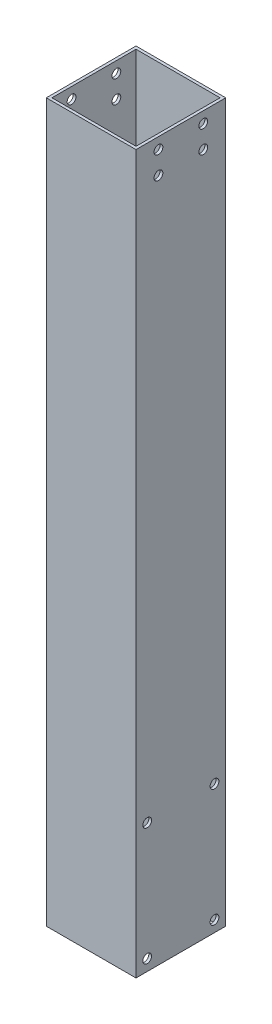
ISO-10303-21;
HEADER;
FILE_DESCRIPTION(('STEP AP214'),'2;1');
FILE_NAME('part.step','',(''),(''),'','','');
FILE_SCHEMA(('AUTOMOTIVE_DESIGN { 1 0 10303 214 1 1 1 1 }'));
ENDSEC;
DATA;
#1=APPLICATION_CONTEXT('core data for automotive mechanical design processes');
#2=APPLICATION_PROTOCOL_DEFINITION('international standard','automotive_design',2000,#1);
#3=PRODUCT_CONTEXT('',#1,'mechanical');
#4=PRODUCT('Part','Part','',(#3));
#5=PRODUCT_RELATED_PRODUCT_CATEGORY('part','',(#4));
#6=PRODUCT_DEFINITION_FORMATION('','',#4);
#7=PRODUCT_DEFINITION_CONTEXT('part definition',#1,'design');
#8=PRODUCT_DEFINITION('design','',#6,#7);
#9=PRODUCT_DEFINITION_SHAPE('','',#8);
#10=(LENGTH_UNIT() NAMED_UNIT(*) SI_UNIT(.MILLI.,.METRE.));
#11=(NAMED_UNIT(*) PLANE_ANGLE_UNIT() SI_UNIT($,.RADIAN.));
#12=(NAMED_UNIT(*) SI_UNIT($,.STERADIAN.) SOLID_ANGLE_UNIT());
#13=UNCERTAINTY_MEASURE_WITH_UNIT(LENGTH_MEASURE(1.E-05),#10,'distance_accuracy_value','');
#14=(GEOMETRIC_REPRESENTATION_CONTEXT(3) GLOBAL_UNCERTAINTY_ASSIGNED_CONTEXT((#13)) GLOBAL_UNIT_ASSIGNED_CONTEXT((#10,
#11,#12)) REPRESENTATION_CONTEXT('',''));
#15=CARTESIAN_POINT('',(0.,0.,0.));
#16=DIRECTION('',(0.,0.,1.));
#17=DIRECTION('',(1.,0.,0.));
#18=AXIS2_PLACEMENT_3D('',#15,#16,#17);
#19=CARTESIAN_POINT('',(0.,406.4,50.8));
#20=DIRECTION('',(0.,1.,0.));
#21=DIRECTION('',(0.,0.,-1.));
#22=AXIS2_PLACEMENT_3D('',#19,#20,#21);
#23=PLANE('',#22);
#24=DIRECTION('',(-1.,0.,0.));
#25=VECTOR('',#24,1.);
#26=CARTESIAN_POINT('',(0.,406.4,0.));
#27=LINE('',#26,#25);
#28=CARTESIAN_POINT('',(50.8,406.4,0.));
#29=VERTEX_POINT('',#28);
#30=CARTESIAN_POINT('',(0.,406.4,0.));
#31=VERTEX_POINT('',#30);
#32=EDGE_CURVE('E148',#29,#31,#27,.T.);
#33=ORIENTED_EDGE('',*,*,#32,.T.);
#34=DIRECTION('',(0.,0.,-1.));
#35=VECTOR('',#34,1.);
#36=CARTESIAN_POINT('',(0.,406.4,50.8));
#37=LINE('',#36,#35);
#38=CARTESIAN_POINT('',(0.,406.4,50.8));
#39=VERTEX_POINT('',#38);
#40=EDGE_CURVE('E11',#39,#31,#37,.T.);
#41=ORIENTED_EDGE('',*,*,#40,.F.);
#42=DIRECTION('',(-1.,0.,0.));
#43=VECTOR('',#42,1.);
#44=CARTESIAN_POINT('',(0.,406.4,50.8));
#45=LINE('',#44,#43);
#46=CARTESIAN_POINT('',(50.8,406.4,50.8));
#47=VERTEX_POINT('',#46);
#48=EDGE_CURVE('E153',#47,#39,#45,.T.);
#49=ORIENTED_EDGE('',*,*,#48,.F.);
#50=DIRECTION('',(0.,0.,-1.));
#51=VECTOR('',#50,1.);
#52=CARTESIAN_POINT('',(50.8,406.4,50.8));
#53=LINE('',#52,#51);
#54=EDGE_CURVE('E48',#47,#29,#53,.T.);
#55=ORIENTED_EDGE('',*,*,#54,.T.);
#56=EDGE_LOOP('',(#33,#41,#49,#55));
#57=FACE_BOUND('',#56,.T.);
#58=DIRECTION('',(0.,0.,-1.));
#59=VECTOR('',#58,1.);
#60=CARTESIAN_POINT('',(49.2125,406.4,50.8));
#61=LINE('',#60,#59);
#62=CARTESIAN_POINT('',(49.2125,406.4,49.2125));
#63=VERTEX_POINT('',#62);
#64=CARTESIAN_POINT('',(49.2125,406.4,1.5875));
#65=VERTEX_POINT('',#64);
#66=EDGE_CURVE('E128',#63,#65,#61,.T.);
#67=ORIENTED_EDGE('',*,*,#66,.F.);
#68=DIRECTION('',(-1.,0.,0.));
#69=VECTOR('',#68,1.);
#70=CARTESIAN_POINT('',(0.,406.4,49.2125));
#71=LINE('',#70,#69);
#72=CARTESIAN_POINT('',(1.5875,406.4,49.2125));
#73=VERTEX_POINT('',#72);
#74=EDGE_CURVE('E126',#63,#73,#71,.T.);
#75=ORIENTED_EDGE('',*,*,#74,.T.);
#76=DIRECTION('',(0.,0.,-1.));
#77=VECTOR('',#76,1.);
#78=CARTESIAN_POINT('',(1.5875,406.4,50.8));
#79=LINE('',#78,#77);
#80=CARTESIAN_POINT('',(1.5875,406.4,1.5875));
#81=VERTEX_POINT('',#80);
#82=EDGE_CURVE('E108',#73,#81,#79,.T.);
#83=ORIENTED_EDGE('',*,*,#82,.T.);
#84=DIRECTION('',(-1.,0.,0.));
#85=VECTOR('',#84,1.);
#86=CARTESIAN_POINT('',(0.,406.4,1.5875));
#87=LINE('',#86,#85);
#88=EDGE_CURVE('E119',#65,#81,#87,.T.);
#89=ORIENTED_EDGE('',*,*,#88,.F.);
#90=EDGE_LOOP('',(#67,#75,#83,#89));
#91=FACE_BOUND('',#90,.T.);
#92=ADVANCED_FACE('F39',(#57,#91),#23,.T.);
#93=CARTESIAN_POINT('',(0.,0.,50.8));
#94=DIRECTION('',(0.,-1.,0.));
#95=DIRECTION('',(0.,0.,1.));
#96=AXIS2_PLACEMENT_3D('',#93,#94,#95);
#97=PLANE('',#96);
#98=DIRECTION('',(1.,0.,0.));
#99=VECTOR('',#98,1.);
#100=CARTESIAN_POINT('',(0.,0.,0.));
#101=LINE('',#100,#99);
#102=CARTESIAN_POINT('',(0.,0.,0.));
#103=VERTEX_POINT('',#102);
#104=CARTESIAN_POINT('',(50.8,0.,0.));
#105=VERTEX_POINT('',#104);
#106=EDGE_CURVE('E130',#103,#105,#101,.T.);
#107=ORIENTED_EDGE('',*,*,#106,.T.);
#108=DIRECTION('',(0.,0.,-1.));
#109=VECTOR('',#108,1.);
#110=CARTESIAN_POINT('',(50.8,0.,50.8));
#111=LINE('',#110,#109);
#112=CARTESIAN_POINT('',(50.8,0.,50.8));
#113=VERTEX_POINT('',#112);
#114=EDGE_CURVE('E165',#113,#105,#111,.T.);
#115=ORIENTED_EDGE('',*,*,#114,.F.);
#116=DIRECTION('',(1.,0.,0.));
#117=VECTOR('',#116,1.);
#118=CARTESIAN_POINT('',(0.,0.,50.8));
#119=LINE('',#118,#117);
#120=CARTESIAN_POINT('',(0.,0.,50.8));
#121=VERTEX_POINT('',#120);
#122=EDGE_CURVE('E147',#121,#113,#119,.T.);
#123=ORIENTED_EDGE('',*,*,#122,.F.);
#124=DIRECTION('',(0.,0.,-1.));
#125=VECTOR('',#124,1.);
#126=CARTESIAN_POINT('',(0.,0.,50.8));
#127=LINE('',#126,#125);
#128=EDGE_CURVE('E155',#121,#103,#127,.T.);
#129=ORIENTED_EDGE('',*,*,#128,.T.);
#130=EDGE_LOOP('',(#107,#115,#123,#129));
#131=FACE_BOUND('',#130,.T.);
#132=DIRECTION('',(0.,0.,-1.));
#133=VECTOR('',#132,1.);
#134=CARTESIAN_POINT('',(1.5875,0.,50.8));
#135=LINE('',#134,#133);
#136=CARTESIAN_POINT('',(1.5875,0.,49.2125));
#137=VERTEX_POINT('',#136);
#138=CARTESIAN_POINT('',(1.5875,0.,1.5875));
#139=VERTEX_POINT('',#138);
#140=EDGE_CURVE('E111',#137,#139,#135,.T.);
#141=ORIENTED_EDGE('',*,*,#140,.F.);
#142=DIRECTION('',(1.,0.,0.));
#143=VECTOR('',#142,1.);
#144=CARTESIAN_POINT('',(0.,0.,49.2125));
#145=LINE('',#144,#143);
#146=CARTESIAN_POINT('',(49.2125,0.,49.2125));
#147=VERTEX_POINT('',#146);
#148=EDGE_CURVE('E139',#137,#147,#145,.T.);
#149=ORIENTED_EDGE('',*,*,#148,.T.);
#150=DIRECTION('',(0.,0.,-1.));
#151=VECTOR('',#150,1.);
#152=CARTESIAN_POINT('',(49.2125,0.,50.8));
#153=LINE('',#152,#151);
#154=CARTESIAN_POINT('',(49.2125,0.,1.5875));
#155=VERTEX_POINT('',#154);
#156=EDGE_CURVE('E132',#147,#155,#153,.T.);
#157=ORIENTED_EDGE('',*,*,#156,.T.);
#158=DIRECTION('',(1.,0.,0.));
#159=VECTOR('',#158,1.);
#160=CARTESIAN_POINT('',(0.,0.,1.5875));
#161=LINE('',#160,#159);
#162=EDGE_CURVE('E115',#139,#155,#161,.T.);
#163=ORIENTED_EDGE('',*,*,#162,.F.);
#164=EDGE_LOOP('',(#141,#149,#157,#163));
#165=FACE_BOUND('',#164,.T.);
#166=ADVANCED_FACE('F256',(#131,#165),#97,.T.);
#167=CARTESIAN_POINT('',(0.,0.,50.8));
#168=DIRECTION('',(-1.,0.,0.));
#169=DIRECTION('',(0.,0.,-1.));
#170=AXIS2_PLACEMENT_3D('',#167,#168,#169);
#171=PLANE('',#170);
#172=CARTESIAN_POINT('',(0.,73.025,44.45));
#173=DIRECTION('',(1.,0.,0.));
#174=DIRECTION('',(0.,0.,-1.));
#175=AXIS2_PLACEMENT_3D('',#172,#173,#174);
#176=CIRCLE('',#175,2.4892);
#177=CARTESIAN_POINT('',(0.,73.025,41.9608));
#178=VERTEX_POINT('',#177);
#179=EDGE_CURVE('E596',#178,#178,#176,.T.);
#180=ORIENTED_EDGE('',*,*,#179,.T.);
#181=EDGE_LOOP('',(#180));
#182=FACE_BOUND('',#181,.T.);
#183=CARTESIAN_POINT('',(0.,73.025,6.35));
#184=DIRECTION('',(1.,0.,0.));
#185=DIRECTION('',(0.,0.,-1.));
#186=AXIS2_PLACEMENT_3D('',#183,#184,#185);
#187=CIRCLE('',#186,2.4892);
#188=CARTESIAN_POINT('',(0.,73.025,3.8608));
#189=VERTEX_POINT('',#188);
#190=EDGE_CURVE('E610',#189,#189,#187,.T.);
#191=ORIENTED_EDGE('',*,*,#190,.T.);
#192=EDGE_LOOP('',(#191));
#193=FACE_BOUND('',#192,.T.);
#194=CARTESIAN_POINT('',(0.,6.35000000000004,6.35000000000005));
#195=DIRECTION('',(1.,0.,0.));
#196=DIRECTION('',(0.,0.,-1.));
#197=AXIS2_PLACEMENT_3D('',#194,#195,#196);
#198=CIRCLE('',#197,2.4892);
#199=CARTESIAN_POINT('',(0.,6.35000000000004,3.86080000000005));
#200=VERTEX_POINT('',#199);
#201=EDGE_CURVE('E604',#200,#200,#198,.T.);
#202=ORIENTED_EDGE('',*,*,#201,.T.);
#203=EDGE_LOOP('',(#202));
#204=FACE_BOUND('',#203,.T.);
#205=CARTESIAN_POINT('',(0.,6.35000000000003,44.4500000000001));
#206=DIRECTION('',(1.,0.,0.));
#207=DIRECTION('',(0.,0.,-1.));
#208=AXIS2_PLACEMENT_3D('',#205,#206,#207);
#209=CIRCLE('',#208,2.4892);
#210=CARTESIAN_POINT('',(0.,6.35000000000003,41.9608000000001));
#211=VERTEX_POINT('',#210);
#212=EDGE_CURVE('E602',#211,#211,#209,.T.);
#213=ORIENTED_EDGE('',*,*,#212,.T.);
#214=EDGE_LOOP('',(#213));
#215=FACE_BOUND('',#214,.T.);
#216=CARTESIAN_POINT('',(0.,400.05,12.7));
#217=DIRECTION('',(1.,0.,0.));
#218=DIRECTION('',(0.,0.,-1.));
#219=AXIS2_PLACEMENT_3D('',#216,#217,#218);
#220=CIRCLE('',#219,2.48920000000001);
#221=CARTESIAN_POINT('',(0.,400.05,10.2108));
#222=VERTEX_POINT('',#221);
#223=EDGE_CURVE('E218',#222,#222,#220,.T.);
#224=ORIENTED_EDGE('',*,*,#223,.T.);
#225=EDGE_LOOP('',(#224));
#226=FACE_BOUND('',#225,.T.);
#227=CARTESIAN_POINT('',(0.,387.35,38.1));
#228=DIRECTION('',(1.,0.,0.));
#229=DIRECTION('',(0.,0.,-1.));
#230=AXIS2_PLACEMENT_3D('',#227,#228,#229);
#231=CIRCLE('',#230,2.4892);
#232=CARTESIAN_POINT('',(0.,387.35,35.6108));
#233=VERTEX_POINT('',#232);
#234=EDGE_CURVE('E225',#233,#233,#231,.T.);
#235=ORIENTED_EDGE('',*,*,#234,.T.);
#236=EDGE_LOOP('',(#235));
#237=FACE_BOUND('',#236,.T.);
#238=CARTESIAN_POINT('',(0.,387.35,12.7));
#239=DIRECTION('',(1.,0.,0.));
#240=DIRECTION('',(0.,0.,-1.));
#241=AXIS2_PLACEMENT_3D('',#238,#239,#240);
#242=CIRCLE('',#241,2.48920000000001);
#243=CARTESIAN_POINT('',(0.,387.35,10.2108));
#244=VERTEX_POINT('',#243);
#245=EDGE_CURVE('E212',#244,#244,#242,.T.);
#246=ORIENTED_EDGE('',*,*,#245,.T.);
#247=EDGE_LOOP('',(#246));
#248=FACE_BOUND('',#247,.T.);
#249=CARTESIAN_POINT('',(0.,400.05,38.1));
#250=DIRECTION('',(1.,0.,0.));
#251=DIRECTION('',(0.,0.,-1.));
#252=AXIS2_PLACEMENT_3D('',#249,#250,#251);
#253=CIRCLE('',#252,2.4892);
#254=CARTESIAN_POINT('',(0.,400.05,35.6108));
#255=VERTEX_POINT('',#254);
#256=EDGE_CURVE('E221',#255,#255,#253,.T.);
#257=ORIENTED_EDGE('',*,*,#256,.T.);
#258=EDGE_LOOP('',(#257));
#259=FACE_BOUND('',#258,.T.);
#260=DIRECTION('',(0.,-1.,0.));
#261=VECTOR('',#260,1.);
#262=CARTESIAN_POINT('',(0.,0.,0.));
#263=LINE('',#262,#261);
#264=EDGE_CURVE('E127',#31,#103,#263,.T.);
#265=ORIENTED_EDGE('',*,*,#264,.T.);
#266=ORIENTED_EDGE('',*,*,#128,.F.);
#267=DIRECTION('',(0.,-1.,0.));
#268=VECTOR('',#267,1.);
#269=CARTESIAN_POINT('',(0.,0.,50.8));
#270=LINE('',#269,#268);
#271=EDGE_CURVE('E145',#39,#121,#270,.T.);
#272=ORIENTED_EDGE('',*,*,#271,.F.);
#273=ORIENTED_EDGE('',*,*,#40,.T.);
#274=EDGE_LOOP('',(#265,#266,#272,#273));
#275=FACE_BOUND('',#274,.T.);
#276=ADVANCED_FACE('F41',(#182,#193,#204,#215,#226,#237,#248,#259,#275),#171,.T.);
#277=CARTESIAN_POINT('',(50.8,0.,50.8));
#278=DIRECTION('',(1.,0.,0.));
#279=DIRECTION('',(0.,0.,1.));
#280=AXIS2_PLACEMENT_3D('',#277,#278,#279);
#281=PLANE('',#280);
#282=CARTESIAN_POINT('',(50.8,73.025,44.45));
#283=DIRECTION('',(1.,0.,0.));
#284=DIRECTION('',(0.,0.,-1.));
#285=AXIS2_PLACEMENT_3D('',#282,#283,#284);
#286=CIRCLE('',#285,2.4892);
#287=CARTESIAN_POINT('',(50.8,73.025,41.9608));
#288=VERTEX_POINT('',#287);
#289=EDGE_CURVE('E280',#288,#288,#286,.T.);
#290=ORIENTED_EDGE('',*,*,#289,.F.);
#291=EDGE_LOOP('',(#290));
#292=FACE_BOUND('',#291,.T.);
#293=CARTESIAN_POINT('',(50.8,73.025,6.35));
#294=DIRECTION('',(1.,0.,0.));
#295=DIRECTION('',(0.,0.,-1.));
#296=AXIS2_PLACEMENT_3D('',#293,#294,#295);
#297=CIRCLE('',#296,2.4892);
#298=CARTESIAN_POINT('',(50.8,73.025,3.8608));
#299=VERTEX_POINT('',#298);
#300=EDGE_CURVE('E284',#299,#299,#297,.T.);
#301=ORIENTED_EDGE('',*,*,#300,.F.);
#302=EDGE_LOOP('',(#301));
#303=FACE_BOUND('',#302,.T.);
#304=CARTESIAN_POINT('',(50.8,6.35000000000004,6.35000000000005));
#305=DIRECTION('',(1.,0.,0.));
#306=DIRECTION('',(0.,0.,-1.));
#307=AXIS2_PLACEMENT_3D('',#304,#305,#306);
#308=CIRCLE('',#307,2.4892);
#309=CARTESIAN_POINT('',(50.8,6.35000000000004,3.86080000000005));
#310=VERTEX_POINT('',#309);
#311=EDGE_CURVE('E288',#310,#310,#308,.T.);
#312=ORIENTED_EDGE('',*,*,#311,.F.);
#313=EDGE_LOOP('',(#312));
#314=FACE_BOUND('',#313,.T.);
#315=CARTESIAN_POINT('',(50.8,6.35000000000003,44.4500000000001));
#316=DIRECTION('',(1.,0.,0.));
#317=DIRECTION('',(0.,0.,-1.));
#318=AXIS2_PLACEMENT_3D('',#315,#316,#317);
#319=CIRCLE('',#318,2.4892);
#320=CARTESIAN_POINT('',(50.8,6.35000000000003,41.9608000000001));
#321=VERTEX_POINT('',#320);
#322=EDGE_CURVE('E190',#321,#321,#319,.T.);
#323=ORIENTED_EDGE('',*,*,#322,.F.);
#324=EDGE_LOOP('',(#323));
#325=FACE_BOUND('',#324,.T.);
#326=CARTESIAN_POINT('',(50.8,400.05,12.7));
#327=DIRECTION('',(1.,0.,0.));
#328=DIRECTION('',(0.,0.,-1.));
#329=AXIS2_PLACEMENT_3D('',#326,#327,#328);
#330=CIRCLE('',#329,2.48920000000001);
#331=CARTESIAN_POINT('',(50.8,400.05,10.2108));
#332=VERTEX_POINT('',#331);
#333=EDGE_CURVE('E222',#332,#332,#330,.T.);
#334=ORIENTED_EDGE('',*,*,#333,.F.);
#335=EDGE_LOOP('',(#334));
#336=FACE_BOUND('',#335,.T.);
#337=CARTESIAN_POINT('',(50.8,387.35,38.1));
#338=DIRECTION('',(1.,0.,0.));
#339=DIRECTION('',(0.,0.,-1.));
#340=AXIS2_PLACEMENT_3D('',#337,#338,#339);
#341=CIRCLE('',#340,2.4892);
#342=CARTESIAN_POINT('',(50.8,387.35,35.6108));
#343=VERTEX_POINT('',#342);
#344=EDGE_CURVE('E215',#343,#343,#341,.T.);
#345=ORIENTED_EDGE('',*,*,#344,.F.);
#346=EDGE_LOOP('',(#345));
#347=FACE_BOUND('',#346,.T.);
#348=CARTESIAN_POINT('',(50.8,387.35,12.7));
#349=DIRECTION('',(1.,0.,0.));
#350=DIRECTION('',(0.,0.,-1.));
#351=AXIS2_PLACEMENT_3D('',#348,#349,#350);
#352=CIRCLE('',#351,2.48920000000001);
#353=CARTESIAN_POINT('',(50.8,387.35,10.2108));
#354=VERTEX_POINT('',#353);
#355=EDGE_CURVE('E211',#354,#354,#352,.T.);
#356=ORIENTED_EDGE('',*,*,#355,.F.);
#357=EDGE_LOOP('',(#356));
#358=FACE_BOUND('',#357,.T.);
#359=CARTESIAN_POINT('',(50.8,400.05,38.1));
#360=DIRECTION('',(1.,0.,0.));
#361=DIRECTION('',(0.,0.,-1.));
#362=AXIS2_PLACEMENT_3D('',#359,#360,#361);
#363=CIRCLE('',#362,2.4892);
#364=CARTESIAN_POINT('',(50.8,400.05,35.6108));
#365=VERTEX_POINT('',#364);
#366=EDGE_CURVE('E174',#365,#365,#363,.T.);
#367=ORIENTED_EDGE('',*,*,#366,.F.);
#368=EDGE_LOOP('',(#367));
#369=FACE_BOUND('',#368,.T.);
#370=DIRECTION('',(0.,1.,0.));
#371=VECTOR('',#370,1.);
#372=CARTESIAN_POINT('',(50.8,0.,0.));
#373=LINE('',#372,#371);
#374=EDGE_CURVE('E159',#105,#29,#373,.T.);
#375=ORIENTED_EDGE('',*,*,#374,.T.);
#376=ORIENTED_EDGE('',*,*,#54,.F.);
#377=DIRECTION('',(0.,1.,0.));
#378=VECTOR('',#377,1.);
#379=CARTESIAN_POINT('',(50.8,0.,50.8));
#380=LINE('',#379,#378);
#381=EDGE_CURVE('E151',#113,#47,#380,.T.);
#382=ORIENTED_EDGE('',*,*,#381,.F.);
#383=ORIENTED_EDGE('',*,*,#114,.T.);
#384=EDGE_LOOP('',(#375,#376,#382,#383));
#385=FACE_BOUND('',#384,.T.);
#386=ADVANCED_FACE('F267',(#292,#303,#314,#325,#336,#347,#358,#369,#385),#281,.T.);
#387=CARTESIAN_POINT('',(0.,0.,50.8));
#388=DIRECTION('',(0.,0.,1.));
#389=DIRECTION('',(-1.,0.,0.));
#390=AXIS2_PLACEMENT_3D('',#387,#388,#389);
#391=PLANE('',#390);
#392=ORIENTED_EDGE('',*,*,#271,.T.);
#393=ORIENTED_EDGE('',*,*,#122,.T.);
#394=ORIENTED_EDGE('',*,*,#381,.T.);
#395=ORIENTED_EDGE('',*,*,#48,.T.);
#396=EDGE_LOOP('',(#392,#393,#394,#395));
#397=FACE_BOUND('',#396,.T.);
#398=ADVANCED_FACE('F269',(#397),#391,.T.);
#399=CARTESIAN_POINT('',(0.,0.,0.));
#400=DIRECTION('',(0.,0.,1.));
#401=DIRECTION('',(-1.,0.,0.));
#402=AXIS2_PLACEMENT_3D('',#399,#400,#401);
#403=PLANE('',#402);
#404=ORIENTED_EDGE('',*,*,#264,.F.);
#405=ORIENTED_EDGE('',*,*,#32,.F.);
#406=ORIENTED_EDGE('',*,*,#374,.F.);
#407=ORIENTED_EDGE('',*,*,#106,.F.);
#408=EDGE_LOOP('',(#404,#405,#406,#407));
#409=FACE_BOUND('',#408,.T.);
#410=ADVANCED_FACE('F265',(#409),#403,.F.);
#411=CARTESIAN_POINT('',(1.5875,0.,50.8));
#412=DIRECTION('',(-1.,0.,0.));
#413=DIRECTION('',(0.,0.,-1.));
#414=AXIS2_PLACEMENT_3D('',#411,#412,#413);
#415=PLANE('',#414);
#416=CARTESIAN_POINT('',(1.5875,73.025,44.45));
#417=DIRECTION('',(1.,0.,0.));
#418=DIRECTION('',(0.,0.,-1.));
#419=AXIS2_PLACEMENT_3D('',#416,#417,#418);
#420=CIRCLE('',#419,2.4892);
#421=CARTESIAN_POINT('',(1.5875,73.025,41.9608));
#422=VERTEX_POINT('',#421);
#423=EDGE_CURVE('E208',#422,#422,#420,.T.);
#424=ORIENTED_EDGE('',*,*,#423,.F.);
#425=EDGE_LOOP('',(#424));
#426=FACE_BOUND('',#425,.T.);
#427=CARTESIAN_POINT('',(1.5875,73.025,6.35));
#428=DIRECTION('',(1.,0.,0.));
#429=DIRECTION('',(0.,0.,-1.));
#430=AXIS2_PLACEMENT_3D('',#427,#428,#429);
#431=CIRCLE('',#430,2.4892);
#432=CARTESIAN_POINT('',(1.5875,73.025,3.8608));
#433=VERTEX_POINT('',#432);
#434=EDGE_CURVE('E196',#433,#433,#431,.T.);
#435=ORIENTED_EDGE('',*,*,#434,.F.);
#436=EDGE_LOOP('',(#435));
#437=FACE_BOUND('',#436,.T.);
#438=CARTESIAN_POINT('',(1.5875,6.35000000000004,6.35000000000005));
#439=DIRECTION('',(1.,0.,0.));
#440=DIRECTION('',(0.,0.,-1.));
#441=AXIS2_PLACEMENT_3D('',#438,#439,#440);
#442=CIRCLE('',#441,2.4892);
#443=CARTESIAN_POINT('',(1.5875,6.35000000000004,3.86080000000005));
#444=VERTEX_POINT('',#443);
#445=EDGE_CURVE('E193',#444,#444,#442,.T.);
#446=ORIENTED_EDGE('',*,*,#445,.F.);
#447=EDGE_LOOP('',(#446));
#448=FACE_BOUND('',#447,.T.);
#449=CARTESIAN_POINT('',(1.5875,6.35000000000003,44.4500000000001));
#450=DIRECTION('',(1.,0.,0.));
#451=DIRECTION('',(0.,0.,-1.));
#452=AXIS2_PLACEMENT_3D('',#449,#450,#451);
#453=CIRCLE('',#452,2.4892);
#454=CARTESIAN_POINT('',(1.5875,6.35000000000003,41.9608000000001));
#455=VERTEX_POINT('',#454);
#456=EDGE_CURVE('E189',#455,#455,#453,.T.);
#457=ORIENTED_EDGE('',*,*,#456,.F.);
#458=EDGE_LOOP('',(#457));
#459=FACE_BOUND('',#458,.T.);
#460=CARTESIAN_POINT('',(1.5875,400.05,12.7));
#461=DIRECTION('',(1.,0.,0.));
#462=DIRECTION('',(0.,0.,-1.));
#463=AXIS2_PLACEMENT_3D('',#460,#461,#462);
#464=CIRCLE('',#463,2.48920000000001);
#465=CARTESIAN_POINT('',(1.5875,400.05,10.2108));
#466=VERTEX_POINT('',#465);
#467=EDGE_CURVE('E116',#466,#466,#464,.T.);
#468=ORIENTED_EDGE('',*,*,#467,.F.);
#469=EDGE_LOOP('',(#468));
#470=FACE_BOUND('',#469,.T.);
#471=CARTESIAN_POINT('',(1.5875,387.35,38.1));
#472=DIRECTION('',(1.,0.,0.));
#473=DIRECTION('',(0.,0.,-1.));
#474=AXIS2_PLACEMENT_3D('',#471,#472,#473);
#475=CIRCLE('',#474,2.4892);
#476=CARTESIAN_POINT('',(1.5875,387.35,35.6108));
#477=VERTEX_POINT('',#476);
#478=EDGE_CURVE('E182',#477,#477,#475,.T.);
#479=ORIENTED_EDGE('',*,*,#478,.F.);
#480=EDGE_LOOP('',(#479));
#481=FACE_BOUND('',#480,.T.);
#482=CARTESIAN_POINT('',(1.5875,387.35,12.7));
#483=DIRECTION('',(1.,0.,0.));
#484=DIRECTION('',(0.,0.,-1.));
#485=AXIS2_PLACEMENT_3D('',#482,#483,#484);
#486=CIRCLE('',#485,2.48920000000001);
#487=CARTESIAN_POINT('',(1.5875,387.35,10.2108));
#488=VERTEX_POINT('',#487);
#489=EDGE_CURVE('E178',#488,#488,#486,.T.);
#490=ORIENTED_EDGE('',*,*,#489,.F.);
#491=EDGE_LOOP('',(#490));
#492=FACE_BOUND('',#491,.T.);
#493=CARTESIAN_POINT('',(1.5875,400.05,38.1));
#494=DIRECTION('',(1.,0.,0.));
#495=DIRECTION('',(0.,0.,-1.));
#496=AXIS2_PLACEMENT_3D('',#493,#494,#495);
#497=CIRCLE('',#496,2.4892);
#498=CARTESIAN_POINT('',(1.5875,400.05,35.6108));
#499=VERTEX_POINT('',#498);
#500=EDGE_CURVE('E173',#499,#499,#497,.T.);
#501=ORIENTED_EDGE('',*,*,#500,.F.);
#502=EDGE_LOOP('',(#501));
#503=FACE_BOUND('',#502,.T.);
#504=DIRECTION('',(0.,-1.,0.));
#505=VECTOR('',#504,1.);
#506=CARTESIAN_POINT('',(1.5875,0.,1.5875));
#507=LINE('',#506,#505);
#508=EDGE_CURVE('E104',#81,#139,#507,.T.);
#509=ORIENTED_EDGE('',*,*,#508,.F.);
#510=ORIENTED_EDGE('',*,*,#82,.F.);
#511=DIRECTION('',(0.,-1.,0.));
#512=VECTOR('',#511,1.);
#513=CARTESIAN_POINT('',(1.5875,0.,49.2125));
#514=LINE('',#513,#512);
#515=EDGE_CURVE('E56',#73,#137,#514,.T.);
#516=ORIENTED_EDGE('',*,*,#515,.T.);
#517=ORIENTED_EDGE('',*,*,#140,.T.);
#518=EDGE_LOOP('',(#509,#510,#516,#517));
#519=FACE_BOUND('',#518,.T.);
#520=ADVANCED_FACE('F106',(#426,#437,#448,#459,#470,#481,#492,#503,#519),#415,.F.);
#521=CARTESIAN_POINT('',(49.2125,0.,50.8));
#522=DIRECTION('',(1.,0.,0.));
#523=DIRECTION('',(0.,0.,1.));
#524=AXIS2_PLACEMENT_3D('',#521,#522,#523);
#525=PLANE('',#524);
#526=CARTESIAN_POINT('',(49.2125,73.025,44.45));
#527=DIRECTION('',(-1.,0.,0.));
#528=DIRECTION('',(0.,0.,1.));
#529=AXIS2_PLACEMENT_3D('',#526,#527,#528);
#530=CIRCLE('',#529,2.4892);
#531=CARTESIAN_POINT('',(49.2125,73.025,46.9392));
#532=VERTEX_POINT('',#531);
#533=EDGE_CURVE('E43',#532,#532,#530,.T.);
#534=ORIENTED_EDGE('',*,*,#533,.F.);
#535=EDGE_LOOP('',(#534));
#536=FACE_BOUND('',#535,.T.);
#537=CARTESIAN_POINT('',(49.2125,73.025,6.35));
#538=DIRECTION('',(-1.,0.,0.));
#539=DIRECTION('',(0.,0.,1.));
#540=AXIS2_PLACEMENT_3D('',#537,#538,#539);
#541=CIRCLE('',#540,2.4892);
#542=CARTESIAN_POINT('',(49.2125,73.025,8.8392));
#543=VERTEX_POINT('',#542);
#544=EDGE_CURVE('E194',#543,#543,#541,.T.);
#545=ORIENTED_EDGE('',*,*,#544,.F.);
#546=EDGE_LOOP('',(#545));
#547=FACE_BOUND('',#546,.T.);
#548=CARTESIAN_POINT('',(49.2125,6.35000000000004,6.35000000000005));
#549=DIRECTION('',(-1.,0.,0.));
#550=DIRECTION('',(0.,0.,1.));
#551=AXIS2_PLACEMENT_3D('',#548,#549,#550);
#552=CIRCLE('',#551,2.4892);
#553=CARTESIAN_POINT('',(49.2125,6.35000000000004,8.83920000000005));
#554=VERTEX_POINT('',#553);
#555=EDGE_CURVE('E191',#554,#554,#552,.T.);
#556=ORIENTED_EDGE('',*,*,#555,.F.);
#557=EDGE_LOOP('',(#556));
#558=FACE_BOUND('',#557,.T.);
#559=CARTESIAN_POINT('',(49.2125,6.35000000000003,44.4500000000001));
#560=DIRECTION('',(-1.,0.,0.));
#561=DIRECTION('',(0.,0.,1.));
#562=AXIS2_PLACEMENT_3D('',#559,#560,#561);
#563=CIRCLE('',#562,2.4892);
#564=CARTESIAN_POINT('',(49.2125,6.35000000000003,46.9392));
#565=VERTEX_POINT('',#564);
#566=EDGE_CURVE('E186',#565,#565,#563,.T.);
#567=ORIENTED_EDGE('',*,*,#566,.F.);
#568=EDGE_LOOP('',(#567));
#569=FACE_BOUND('',#568,.T.);
#570=CARTESIAN_POINT('',(49.2125,400.05,12.7));
#571=DIRECTION('',(-1.,0.,0.));
#572=DIRECTION('',(0.,0.,1.));
#573=AXIS2_PLACEMENT_3D('',#570,#571,#572);
#574=CIRCLE('',#573,2.48920000000001);
#575=CARTESIAN_POINT('',(49.2125,400.05,15.1892));
#576=VERTEX_POINT('',#575);
#577=EDGE_CURVE('E183',#576,#576,#574,.T.);
#578=ORIENTED_EDGE('',*,*,#577,.F.);
#579=EDGE_LOOP('',(#578));
#580=FACE_BOUND('',#579,.T.);
#581=CARTESIAN_POINT('',(49.2125,387.35,38.1));
#582=DIRECTION('',(-1.,0.,0.));
#583=DIRECTION('',(0.,0.,1.));
#584=AXIS2_PLACEMENT_3D('',#581,#582,#583);
#585=CIRCLE('',#584,2.4892);
#586=CARTESIAN_POINT('',(49.2125,387.35,40.5892));
#587=VERTEX_POINT('',#586);
#588=EDGE_CURVE('E179',#587,#587,#585,.T.);
#589=ORIENTED_EDGE('',*,*,#588,.F.);
#590=EDGE_LOOP('',(#589));
#591=FACE_BOUND('',#590,.T.);
#592=CARTESIAN_POINT('',(49.2125,387.35,12.7));
#593=DIRECTION('',(-1.,0.,0.));
#594=DIRECTION('',(0.,0.,1.));
#595=AXIS2_PLACEMENT_3D('',#592,#593,#594);
#596=CIRCLE('',#595,2.48920000000001);
#597=CARTESIAN_POINT('',(49.2125,387.35,15.1892));
#598=VERTEX_POINT('',#597);
#599=EDGE_CURVE('E175',#598,#598,#596,.T.);
#600=ORIENTED_EDGE('',*,*,#599,.F.);
#601=EDGE_LOOP('',(#600));
#602=FACE_BOUND('',#601,.T.);
#603=CARTESIAN_POINT('',(49.2125,400.05,38.1));
#604=DIRECTION('',(-1.,0.,0.));
#605=DIRECTION('',(0.,0.,1.));
#606=AXIS2_PLACEMENT_3D('',#603,#604,#605);
#607=CIRCLE('',#606,2.4892);
#608=CARTESIAN_POINT('',(49.2125,400.05,40.5892));
#609=VERTEX_POINT('',#608);
#610=EDGE_CURVE('E170',#609,#609,#607,.T.);
#611=ORIENTED_EDGE('',*,*,#610,.F.);
#612=EDGE_LOOP('',(#611));
#613=FACE_BOUND('',#612,.T.);
#614=DIRECTION('',(0.,1.,0.));
#615=VECTOR('',#614,1.);
#616=CARTESIAN_POINT('',(49.2125,0.,1.5875));
#617=LINE('',#616,#615);
#618=EDGE_CURVE('E121',#155,#65,#617,.T.);
#619=ORIENTED_EDGE('',*,*,#618,.F.);
#620=ORIENTED_EDGE('',*,*,#156,.F.);
#621=DIRECTION('',(0.,1.,0.));
#622=VECTOR('',#621,1.);
#623=CARTESIAN_POINT('',(49.2125,0.,49.2125));
#624=LINE('',#623,#622);
#625=EDGE_CURVE('E61',#147,#63,#624,.T.);
#626=ORIENTED_EDGE('',*,*,#625,.T.);
#627=ORIENTED_EDGE('',*,*,#66,.T.);
#628=EDGE_LOOP('',(#619,#620,#626,#627));
#629=FACE_BOUND('',#628,.T.);
#630=ADVANCED_FACE('F243',(#536,#547,#558,#569,#580,#591,#602,#613,#629),#525,.F.);
#631=CARTESIAN_POINT('',(0.,0.,49.2125));
#632=DIRECTION('',(0.,0.,1.));
#633=DIRECTION('',(-1.,0.,0.));
#634=AXIS2_PLACEMENT_3D('',#631,#632,#633);
#635=PLANE('',#634);
#636=ORIENTED_EDGE('',*,*,#515,.F.);
#637=ORIENTED_EDGE('',*,*,#74,.F.);
#638=ORIENTED_EDGE('',*,*,#625,.F.);
#639=ORIENTED_EDGE('',*,*,#148,.F.);
#640=EDGE_LOOP('',(#636,#637,#638,#639));
#641=FACE_BOUND('',#640,.T.);
#642=ADVANCED_FACE('F244',(#641),#635,.F.);
#643=CARTESIAN_POINT('',(0.,0.,1.5875));
#644=DIRECTION('',(0.,0.,1.));
#645=DIRECTION('',(-1.,0.,0.));
#646=AXIS2_PLACEMENT_3D('',#643,#644,#645);
#647=PLANE('',#646);
#648=ORIENTED_EDGE('',*,*,#508,.T.);
#649=ORIENTED_EDGE('',*,*,#162,.T.);
#650=ORIENTED_EDGE('',*,*,#618,.T.);
#651=ORIENTED_EDGE('',*,*,#88,.T.);
#652=EDGE_LOOP('',(#648,#649,#650,#651));
#653=FACE_BOUND('',#652,.T.);
#654=ADVANCED_FACE('F120',(#653),#647,.T.);
#655=CARTESIAN_POINT('',(50.8,400.05,38.1));
#656=DIRECTION('',(-1.,0.,0.));
#657=DIRECTION('',(0.,0.,-1.));
#658=AXIS2_PLACEMENT_3D('',#655,#656,#657);
#659=CYLINDRICAL_SURFACE('',#658,2.4892);
#660=ORIENTED_EDGE('',*,*,#366,.T.);
#661=EDGE_LOOP('',(#660));
#662=FACE_BOUND('',#661,.T.);
#663=ORIENTED_EDGE('',*,*,#610,.T.);
#664=EDGE_LOOP('',(#663));
#665=FACE_BOUND('',#664,.T.);
#666=ADVANCED_FACE('F251',(#662,#665),#659,.F.);
#667=CARTESIAN_POINT('',(50.8,387.35,12.7));
#668=DIRECTION('',(-1.,0.,0.));
#669=DIRECTION('',(0.,0.,-1.));
#670=AXIS2_PLACEMENT_3D('',#667,#668,#669);
#671=CYLINDRICAL_SURFACE('',#670,2.48920000000001);
#672=ORIENTED_EDGE('',*,*,#355,.T.);
#673=EDGE_LOOP('',(#672));
#674=FACE_BOUND('',#673,.T.);
#675=ORIENTED_EDGE('',*,*,#599,.T.);
#676=EDGE_LOOP('',(#675));
#677=FACE_BOUND('',#676,.T.);
#678=ADVANCED_FACE('F341',(#674,#677),#671,.F.);
#679=CARTESIAN_POINT('',(50.8,387.35,38.1));
#680=DIRECTION('',(-1.,0.,0.));
#681=DIRECTION('',(0.,0.,-1.));
#682=AXIS2_PLACEMENT_3D('',#679,#680,#681);
#683=CYLINDRICAL_SURFACE('',#682,2.4892);
#684=ORIENTED_EDGE('',*,*,#344,.T.);
#685=EDGE_LOOP('',(#684));
#686=FACE_BOUND('',#685,.T.);
#687=ORIENTED_EDGE('',*,*,#588,.T.);
#688=EDGE_LOOP('',(#687));
#689=FACE_BOUND('',#688,.T.);
#690=ADVANCED_FACE('F333',(#686,#689),#683,.F.);
#691=CARTESIAN_POINT('',(50.8,400.05,12.7));
#692=DIRECTION('',(-1.,0.,0.));
#693=DIRECTION('',(0.,0.,-1.));
#694=AXIS2_PLACEMENT_3D('',#691,#692,#693);
#695=CYLINDRICAL_SURFACE('',#694,2.48920000000001);
#696=ORIENTED_EDGE('',*,*,#333,.T.);
#697=EDGE_LOOP('',(#696));
#698=FACE_BOUND('',#697,.T.);
#699=ORIENTED_EDGE('',*,*,#577,.T.);
#700=EDGE_LOOP('',(#699));
#701=FACE_BOUND('',#700,.T.);
#702=ADVANCED_FACE('F326',(#698,#701),#695,.F.);
#703=ORIENTED_EDGE('',*,*,#256,.F.);
#704=EDGE_LOOP('',(#703));
#705=FACE_BOUND('',#704,.T.);
#706=ORIENTED_EDGE('',*,*,#500,.T.);
#707=EDGE_LOOP('',(#706));
#708=FACE_BOUND('',#707,.T.);
#709=ADVANCED_FACE('F322',(#705,#708),#659,.F.);
#710=ORIENTED_EDGE('',*,*,#245,.F.);
#711=EDGE_LOOP('',(#710));
#712=FACE_BOUND('',#711,.T.);
#713=ORIENTED_EDGE('',*,*,#489,.T.);
#714=EDGE_LOOP('',(#713));
#715=FACE_BOUND('',#714,.T.);
#716=ADVANCED_FACE('F325',(#712,#715),#671,.F.);
#717=ORIENTED_EDGE('',*,*,#234,.F.);
#718=EDGE_LOOP('',(#717));
#719=FACE_BOUND('',#718,.T.);
#720=ORIENTED_EDGE('',*,*,#478,.T.);
#721=EDGE_LOOP('',(#720));
#722=FACE_BOUND('',#721,.T.);
#723=ADVANCED_FACE('F328',(#719,#722),#683,.F.);
#724=ORIENTED_EDGE('',*,*,#223,.F.);
#725=EDGE_LOOP('',(#724));
#726=FACE_BOUND('',#725,.T.);
#727=ORIENTED_EDGE('',*,*,#467,.T.);
#728=EDGE_LOOP('',(#727));
#729=FACE_BOUND('',#728,.T.);
#730=ADVANCED_FACE('F331',(#726,#729),#695,.F.);
#731=CARTESIAN_POINT('',(50.8,6.35000000000003,44.4500000000001));
#732=DIRECTION('',(-1.,0.,0.));
#733=DIRECTION('',(0.,0.,-1.));
#734=AXIS2_PLACEMENT_3D('',#731,#732,#733);
#735=CYLINDRICAL_SURFACE('',#734,2.4892);
#736=ORIENTED_EDGE('',*,*,#322,.T.);
#737=EDGE_LOOP('',(#736));
#738=FACE_BOUND('',#737,.T.);
#739=ORIENTED_EDGE('',*,*,#566,.T.);
#740=EDGE_LOOP('',(#739));
#741=FACE_BOUND('',#740,.T.);
#742=ADVANCED_FACE('F336',(#738,#741),#735,.F.);
#743=CARTESIAN_POINT('',(50.8,6.35000000000004,6.35000000000005));
#744=DIRECTION('',(-1.,0.,0.));
#745=DIRECTION('',(0.,0.,-1.));
#746=AXIS2_PLACEMENT_3D('',#743,#744,#745);
#747=CYLINDRICAL_SURFACE('',#746,2.4892);
#748=ORIENTED_EDGE('',*,*,#311,.T.);
#749=EDGE_LOOP('',(#748));
#750=FACE_BOUND('',#749,.T.);
#751=ORIENTED_EDGE('',*,*,#555,.T.);
#752=EDGE_LOOP('',(#751));
#753=FACE_BOUND('',#752,.T.);
#754=ADVANCED_FACE('F359',(#750,#753),#747,.F.);
#755=CARTESIAN_POINT('',(50.8,73.025,6.35));
#756=DIRECTION('',(-1.,0.,0.));
#757=DIRECTION('',(0.,0.,-1.));
#758=AXIS2_PLACEMENT_3D('',#755,#756,#757);
#759=CYLINDRICAL_SURFACE('',#758,2.4892);
#760=ORIENTED_EDGE('',*,*,#300,.T.);
#761=EDGE_LOOP('',(#760));
#762=FACE_BOUND('',#761,.T.);
#763=ORIENTED_EDGE('',*,*,#544,.T.);
#764=EDGE_LOOP('',(#763));
#765=FACE_BOUND('',#764,.T.);
#766=ADVANCED_FACE('F356',(#762,#765),#759,.F.);
#767=CARTESIAN_POINT('',(50.8,73.025,44.45));
#768=DIRECTION('',(-1.,0.,0.));
#769=DIRECTION('',(0.,0.,-1.));
#770=AXIS2_PLACEMENT_3D('',#767,#768,#769);
#771=CYLINDRICAL_SURFACE('',#770,2.4892);
#772=ORIENTED_EDGE('',*,*,#289,.T.);
#773=EDGE_LOOP('',(#772));
#774=FACE_BOUND('',#773,.T.);
#775=ORIENTED_EDGE('',*,*,#533,.T.);
#776=EDGE_LOOP('',(#775));
#777=FACE_BOUND('',#776,.T.);
#778=ADVANCED_FACE('F346',(#774,#777),#771,.F.);
#779=ORIENTED_EDGE('',*,*,#212,.F.);
#780=EDGE_LOOP('',(#779));
#781=FACE_BOUND('',#780,.T.);
#782=ORIENTED_EDGE('',*,*,#456,.T.);
#783=EDGE_LOOP('',(#782));
#784=FACE_BOUND('',#783,.T.);
#785=ADVANCED_FACE('F342',(#781,#784),#735,.F.);
#786=ORIENTED_EDGE('',*,*,#201,.F.);
#787=EDGE_LOOP('',(#786));
#788=FACE_BOUND('',#787,.T.);
#789=ORIENTED_EDGE('',*,*,#445,.T.);
#790=EDGE_LOOP('',(#789));
#791=FACE_BOUND('',#790,.T.);
#792=ADVANCED_FACE('F345',(#788,#791),#747,.F.);
#793=ORIENTED_EDGE('',*,*,#190,.F.);
#794=EDGE_LOOP('',(#793));
#795=FACE_BOUND('',#794,.T.);
#796=ORIENTED_EDGE('',*,*,#434,.T.);
#797=EDGE_LOOP('',(#796));
#798=FACE_BOUND('',#797,.T.);
#799=ADVANCED_FACE('F351',(#795,#798),#759,.F.);
#800=ORIENTED_EDGE('',*,*,#179,.F.);
#801=EDGE_LOOP('',(#800));
#802=FACE_BOUND('',#801,.T.);
#803=ORIENTED_EDGE('',*,*,#423,.T.);
#804=EDGE_LOOP('',(#803));
#805=FACE_BOUND('',#804,.T.);
#806=ADVANCED_FACE('F348',(#802,#805),#771,.F.);
#807=CLOSED_SHELL('',(#92,#166,#276,#386,#398,#410,#520,#630,#642,#654,#666,#678,#690,#702,#709,
#716,#723,#730,#742,#754,#766,#778,#785,#792,#799,#806));
#808=MANIFOLD_SOLID_BREP('B2',#807);
#809=ADVANCED_BREP_SHAPE_REPRESENTATION('',(#18,#808),#14);
#810=SHAPE_DEFINITION_REPRESENTATION(#9,#809);
ENDSEC;
END-ISO-10303-21;
